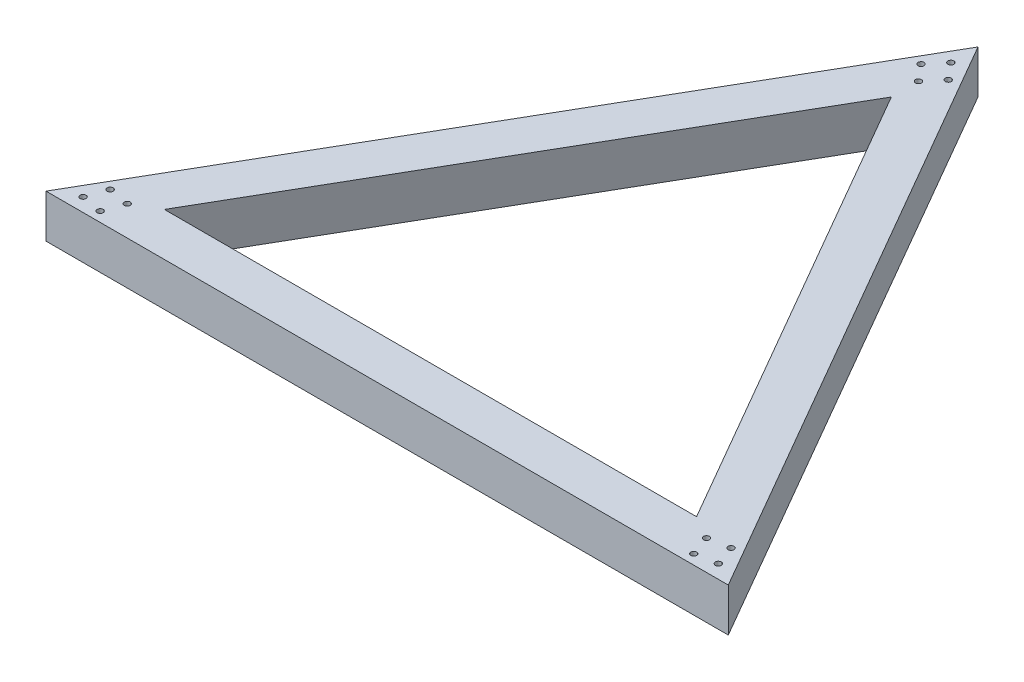
ISO-10303-21;
HEADER;
FILE_DESCRIPTION(('STEP AP214'),'2;1');
FILE_NAME('part.step','',(''),(''),'','','');
FILE_SCHEMA(('AUTOMOTIVE_DESIGN { 1 0 10303 214 1 1 1 1 }'));
ENDSEC;
DATA;
#1=APPLICATION_CONTEXT('core data for automotive mechanical design processes');
#2=APPLICATION_PROTOCOL_DEFINITION('international standard','automotive_design',2000,#1);
#3=PRODUCT_CONTEXT('',#1,'mechanical');
#4=PRODUCT('Part','Part','',(#3));
#5=PRODUCT_RELATED_PRODUCT_CATEGORY('part','',(#4));
#6=PRODUCT_DEFINITION_FORMATION('','',#4);
#7=PRODUCT_DEFINITION_CONTEXT('part definition',#1,'design');
#8=PRODUCT_DEFINITION('design','',#6,#7);
#9=PRODUCT_DEFINITION_SHAPE('','',#8);
#10=(LENGTH_UNIT() NAMED_UNIT(*) SI_UNIT(.MILLI.,.METRE.));
#11=(NAMED_UNIT(*) PLANE_ANGLE_UNIT() SI_UNIT($,.RADIAN.));
#12=(NAMED_UNIT(*) SI_UNIT($,.STERADIAN.) SOLID_ANGLE_UNIT());
#13=UNCERTAINTY_MEASURE_WITH_UNIT(LENGTH_MEASURE(1.E-05),#10,'distance_accuracy_value','');
#14=(GEOMETRIC_REPRESENTATION_CONTEXT(3) GLOBAL_UNCERTAINTY_ASSIGNED_CONTEXT((#13)) GLOBAL_UNIT_ASSIGNED_CONTEXT((#10,
#11,#12)) REPRESENTATION_CONTEXT('',''));
#15=CARTESIAN_POINT('',(0.,0.,0.));
#16=DIRECTION('',(0.,0.,1.));
#17=DIRECTION('',(1.,0.,0.));
#18=AXIS2_PLACEMENT_3D('',#15,#16,#17);
#19=CARTESIAN_POINT('',(0.,50.8,0.));
#20=DIRECTION('',(0.,1.,0.));
#21=DIRECTION('',(0.,0.,1.));
#22=AXIS2_PLACEMENT_3D('',#19,#20,#21);
#23=PLANE('',#22);
#24=CARTESIAN_POINT('',(-169.775713407923,50.8,98.0200538379252));
#25=DIRECTION('',(0.,1.,0.));
#26=DIRECTION('',(0.,0.,1.));
#27=AXIS2_PLACEMENT_3D('',#24,#25,#26);
#28=CIRCLE('',#27,1.75);
#29=CARTESIAN_POINT('',(-169.775713407923,50.8,99.7700538379252));
#30=VERTEX_POINT('',#29);
#31=EDGE_CURVE('E226',#30,#30,#28,.T.);
#32=ORIENTED_EDGE('',*,*,#31,.F.);
#33=EDGE_LOOP('',(#32));
#34=FACE_BOUND('',#33,.T.);
#35=CARTESIAN_POINT('',(-174.002954743875,50.8,109.698257068201));
#36=DIRECTION('',(0.,1.,0.));
#37=DIRECTION('',(0.,0.,1.));
#38=AXIS2_PLACEMENT_3D('',#35,#36,#37);
#39=CIRCLE('',#38,1.75000000000001);
#40=CARTESIAN_POINT('',(-174.002954743875,50.8,111.448257068201));
#41=VERTEX_POINT('',#40);
#42=EDGE_CURVE('E230',#41,#41,#39,.T.);
#43=ORIENTED_EDGE('',*,*,#42,.F.);
#44=EDGE_LOOP('',(#43));
#45=FACE_BOUND('',#44,.T.);
#46=CARTESIAN_POINT('',(-186.230196079827,50.8,107.520053837925));
#47=DIRECTION('',(0.,1.,0.));
#48=DIRECTION('',(0.,0.,1.));
#49=AXIS2_PLACEMENT_3D('',#46,#47,#48);
#50=CIRCLE('',#49,1.75000000000001);
#51=CARTESIAN_POINT('',(-186.230196079827,50.8,109.270053837925));
#52=VERTEX_POINT('',#51);
#53=EDGE_CURVE('E238',#52,#52,#50,.T.);
#54=ORIENTED_EDGE('',*,*,#53,.F.);
#55=EDGE_LOOP('',(#54));
#56=FACE_BOUND('',#55,.T.);
#57=CARTESIAN_POINT('',(174.002954743875,50.8,109.698257068201));
#58=DIRECTION('',(0.,1.,0.));
#59=DIRECTION('',(0.,0.,1.));
#60=AXIS2_PLACEMENT_3D('',#57,#58,#59);
#61=CIRCLE('',#60,1.75000000000001);
#62=CARTESIAN_POINT('',(174.002954743875,50.8,111.448257068201));
#63=VERTEX_POINT('',#62);
#64=EDGE_CURVE('E244',#63,#63,#61,.T.);
#65=ORIENTED_EDGE('',*,*,#64,.F.);
#66=EDGE_LOOP('',(#65));
#67=FACE_BOUND('',#66,.T.);
#68=CARTESIAN_POINT('',(186.230196079827,50.8,107.520053837925));
#69=DIRECTION('',(0.,1.,0.));
#70=DIRECTION('',(0.,0.,1.));
#71=AXIS2_PLACEMENT_3D('',#68,#69,#70);
#72=CIRCLE('',#71,1.75000000000001);
#73=CARTESIAN_POINT('',(186.230196079827,50.8,109.270053837925));
#74=VERTEX_POINT('',#73);
#75=EDGE_CURVE('E250',#74,#74,#72,.T.);
#76=ORIENTED_EDGE('',*,*,#75,.F.);
#77=EDGE_LOOP('',(#76));
#78=FACE_BOUND('',#77,.T.);
#79=CARTESIAN_POINT('',(182.002954743875,50.8,95.8418506076497));
#80=DIRECTION('',(0.,1.,0.));
#81=DIRECTION('',(0.,0.,1.));
#82=AXIS2_PLACEMENT_3D('',#79,#80,#81);
#83=CIRCLE('',#82,1.74999999999999);
#84=CARTESIAN_POINT('',(182.002954743875,50.8,97.5918506076497));
#85=VERTEX_POINT('',#84);
#86=EDGE_CURVE('E256',#85,#85,#83,.T.);
#87=ORIENTED_EDGE('',*,*,#86,.F.);
#88=EDGE_LOOP('',(#87));
#89=FACE_BOUND('',#88,.T.);
#90=CARTESIAN_POINT('',(169.775713407923,50.8,98.0200538379252));
#91=DIRECTION('',(0.,1.,0.));
#92=DIRECTION('',(0.,0.,1.));
#93=AXIS2_PLACEMENT_3D('',#90,#91,#92);
#94=CIRCLE('',#93,1.75000000000001);
#95=CARTESIAN_POINT('',(169.775713407923,50.8,99.7700538379252));
#96=VERTEX_POINT('',#95);
#97=EDGE_CURVE('E262',#96,#96,#94,.T.);
#98=ORIENTED_EDGE('',*,*,#97,.F.);
#99=EDGE_LOOP('',(#98));
#100=FACE_BOUND('',#99,.T.);
#101=CARTESIAN_POINT('',(0.,50.8,-196.04010767585));
#102=DIRECTION('',(0.,1.,0.));
#103=DIRECTION('',(0.,0.,1.));
#104=AXIS2_PLACEMENT_3D('',#101,#102,#103);
#105=CIRCLE('',#104,1.75);
#106=CARTESIAN_POINT('',(0.,50.8,-194.29010767585));
#107=VERTEX_POINT('',#106);
#108=EDGE_CURVE('E268',#107,#107,#105,.T.);
#109=ORIENTED_EDGE('',*,*,#108,.F.);
#110=EDGE_LOOP('',(#109));
#111=FACE_BOUND('',#110,.T.);
#112=CARTESIAN_POINT('',(8.,50.8,-205.54010767585));
#113=DIRECTION('',(0.,1.,0.));
#114=DIRECTION('',(0.,0.,1.));
#115=AXIS2_PLACEMENT_3D('',#112,#113,#114);
#116=CIRCLE('',#115,1.75000000000001);
#117=CARTESIAN_POINT('',(8.,50.8,-203.79010767585));
#118=VERTEX_POINT('',#117);
#119=EDGE_CURVE('E274',#118,#118,#116,.T.);
#120=ORIENTED_EDGE('',*,*,#119,.F.);
#121=EDGE_LOOP('',(#120));
#122=FACE_BOUND('',#121,.T.);
#123=CARTESIAN_POINT('',(0.,50.8,-215.04010767585));
#124=DIRECTION('',(0.,1.,0.));
#125=DIRECTION('',(0.,0.,1.));
#126=AXIS2_PLACEMENT_3D('',#123,#124,#125);
#127=CIRCLE('',#126,1.75);
#128=CARTESIAN_POINT('',(0.,50.8,-213.29010767585));
#129=VERTEX_POINT('',#128);
#130=EDGE_CURVE('E280',#129,#129,#127,.T.);
#131=ORIENTED_EDGE('',*,*,#130,.F.);
#132=EDGE_LOOP('',(#131));
#133=FACE_BOUND('',#132,.T.);
#134=CARTESIAN_POINT('',(-8.,50.8,-205.54010767585));
#135=DIRECTION('',(0.,1.,0.));
#136=DIRECTION('',(0.,0.,1.));
#137=AXIS2_PLACEMENT_3D('',#134,#135,#136);
#138=CIRCLE('',#137,1.75);
#139=CARTESIAN_POINT('',(-8.,50.8,-203.79010767585));
#140=VERTEX_POINT('',#139);
#141=EDGE_CURVE('E286',#140,#140,#138,.T.);
#142=ORIENTED_EDGE('',*,*,#141,.F.);
#143=EDGE_LOOP('',(#142));
#144=FACE_BOUND('',#143,.T.);
#145=CARTESIAN_POINT('',(-182.002954743875,50.8,95.8418506076497));
#146=DIRECTION('',(0.,1.,0.));
#147=DIRECTION('',(0.,0.,1.));
#148=AXIS2_PLACEMENT_3D('',#145,#146,#147);
#149=CIRCLE('',#148,1.75000000000001);
#150=CARTESIAN_POINT('',(-182.002954743875,50.8,97.5918506076497));
#151=VERTEX_POINT('',#150);
#152=EDGE_CURVE('E292',#151,#151,#149,.T.);
#153=ORIENTED_EDGE('',*,*,#152,.F.);
#154=EDGE_LOOP('',(#153));
#155=FACE_BOUND('',#154,.T.);
#156=DIRECTION('',(1.,0.,0.));
#157=VECTOR('',#156,1.);
#158=CARTESIAN_POINT('',(-200.,50.8,115.470053837925));
#159=LINE('',#158,#157);
#160=CARTESIAN_POINT('',(-200.,50.8,115.470053837925));
#161=VERTEX_POINT('',#160);
#162=CARTESIAN_POINT('',(200.,50.8,115.470053837925));
#163=VERTEX_POINT('',#162);
#164=EDGE_CURVE('E119',#161,#163,#159,.T.);
#165=ORIENTED_EDGE('',*,*,#164,.T.);
#166=DIRECTION('',(-0.5,0.,-0.866025403784439));
#167=VECTOR('',#166,1.);
#168=CARTESIAN_POINT('',(200.,50.8,115.470053837925));
#169=LINE('',#168,#167);
#170=CARTESIAN_POINT('',(0.,50.8,-230.94010767585));
#171=VERTEX_POINT('',#170);
#172=EDGE_CURVE('E122',#163,#171,#169,.T.);
#173=ORIENTED_EDGE('',*,*,#172,.T.);
#174=DIRECTION('',(-0.5,0.,0.866025403784439));
#175=VECTOR('',#174,1.);
#176=CARTESIAN_POINT('',(0.,50.8,-230.94010767585));
#177=LINE('',#176,#175);
#178=EDGE_CURVE('E125',#171,#161,#177,.T.);
#179=ORIENTED_EDGE('',*,*,#178,.T.);
#180=EDGE_LOOP('',(#165,#173,#179));
#181=FACE_BOUND('',#180,.T.);
#182=DIRECTION('',(-0.5,0.,-0.866025403784439));
#183=VECTOR('',#182,1.);
#184=CARTESIAN_POINT('',(156.005909487751,50.8,90.0700538379252));
#185=LINE('',#184,#183);
#186=CARTESIAN_POINT('',(156.005909487751,50.8,90.0700538379252));
#187=VERTEX_POINT('',#186);
#188=CARTESIAN_POINT('',(0.,50.8,-180.14010767585));
#189=VERTEX_POINT('',#188);
#190=EDGE_CURVE('E98',#187,#189,#185,.T.);
#191=ORIENTED_EDGE('',*,*,#190,.F.);
#192=DIRECTION('',(1.,0.,0.));
#193=VECTOR('',#192,1.);
#194=CARTESIAN_POINT('',(-156.005909487751,50.8,90.0700538379252));
#195=LINE('',#194,#193);
#196=CARTESIAN_POINT('',(-156.005909487751,50.8,90.0700538379252));
#197=VERTEX_POINT('',#196);
#198=EDGE_CURVE('E90',#197,#187,#195,.T.);
#199=ORIENTED_EDGE('',*,*,#198,.F.);
#200=DIRECTION('',(-0.5,0.,0.866025403784438));
#201=VECTOR('',#200,1.);
#202=CARTESIAN_POINT('',(0.,50.8,-180.14010767585));
#203=LINE('',#202,#201);
#204=EDGE_CURVE('E107',#189,#197,#203,.T.);
#205=ORIENTED_EDGE('',*,*,#204,.F.);
#206=EDGE_LOOP('',(#191,#199,#205));
#207=FACE_BOUND('',#206,.T.);
#208=ADVANCED_FACE('F37',(#34,#45,#56,#67,#78,#89,#100,#111,#122,#133,#144,#155,#181,#207),#23,.T.);
#209=CARTESIAN_POINT('',(0.,25.4,0.));
#210=DIRECTION('',(0.,1.,0.));
#211=DIRECTION('',(0.,0.,1.));
#212=AXIS2_PLACEMENT_3D('',#209,#210,#211);
#213=PLANE('',#212);
#214=CARTESIAN_POINT('',(-169.775713407923,25.4,98.0200538379252));
#215=DIRECTION('',(0.,1.,0.));
#216=DIRECTION('',(0.,0.,1.));
#217=AXIS2_PLACEMENT_3D('',#214,#215,#216);
#218=CIRCLE('',#217,1.75);
#219=CARTESIAN_POINT('',(-169.775713407923,25.4,99.7700538379252));
#220=VERTEX_POINT('',#219);
#221=EDGE_CURVE('E113',#220,#220,#218,.T.);
#222=ORIENTED_EDGE('',*,*,#221,.T.);
#223=EDGE_LOOP('',(#222));
#224=FACE_BOUND('',#223,.T.);
#225=CARTESIAN_POINT('',(-174.002954743875,25.4,109.698257068201));
#226=DIRECTION('',(0.,1.,0.));
#227=DIRECTION('',(0.,0.,1.));
#228=AXIS2_PLACEMENT_3D('',#225,#226,#227);
#229=CIRCLE('',#228,1.75000000000001);
#230=CARTESIAN_POINT('',(-174.002954743875,25.4,111.448257068201));
#231=VERTEX_POINT('',#230);
#232=EDGE_CURVE('E235',#231,#231,#229,.T.);
#233=ORIENTED_EDGE('',*,*,#232,.T.);
#234=EDGE_LOOP('',(#233));
#235=FACE_BOUND('',#234,.T.);
#236=CARTESIAN_POINT('',(-186.230196079827,25.4,107.520053837925));
#237=DIRECTION('',(0.,1.,0.));
#238=DIRECTION('',(0.,0.,1.));
#239=AXIS2_PLACEMENT_3D('',#236,#237,#238);
#240=CIRCLE('',#239,1.75000000000001);
#241=CARTESIAN_POINT('',(-186.230196079827,25.4,109.270053837925));
#242=VERTEX_POINT('',#241);
#243=EDGE_CURVE('E241',#242,#242,#240,.T.);
#244=ORIENTED_EDGE('',*,*,#243,.T.);
#245=EDGE_LOOP('',(#244));
#246=FACE_BOUND('',#245,.T.);
#247=CARTESIAN_POINT('',(174.002954743875,25.4,109.698257068201));
#248=DIRECTION('',(0.,1.,0.));
#249=DIRECTION('',(0.,0.,1.));
#250=AXIS2_PLACEMENT_3D('',#247,#248,#249);
#251=CIRCLE('',#250,1.75000000000001);
#252=CARTESIAN_POINT('',(174.002954743875,25.4,111.448257068201));
#253=VERTEX_POINT('',#252);
#254=EDGE_CURVE('E247',#253,#253,#251,.T.);
#255=ORIENTED_EDGE('',*,*,#254,.T.);
#256=EDGE_LOOP('',(#255));
#257=FACE_BOUND('',#256,.T.);
#258=CARTESIAN_POINT('',(186.230196079827,25.4,107.520053837925));
#259=DIRECTION('',(0.,1.,0.));
#260=DIRECTION('',(0.,0.,1.));
#261=AXIS2_PLACEMENT_3D('',#258,#259,#260);
#262=CIRCLE('',#261,1.75000000000001);
#263=CARTESIAN_POINT('',(186.230196079827,25.4,109.270053837925));
#264=VERTEX_POINT('',#263);
#265=EDGE_CURVE('E253',#264,#264,#262,.T.);
#266=ORIENTED_EDGE('',*,*,#265,.T.);
#267=EDGE_LOOP('',(#266));
#268=FACE_BOUND('',#267,.T.);
#269=CARTESIAN_POINT('',(182.002954743875,25.4,95.8418506076497));
#270=DIRECTION('',(0.,1.,0.));
#271=DIRECTION('',(0.,0.,1.));
#272=AXIS2_PLACEMENT_3D('',#269,#270,#271);
#273=CIRCLE('',#272,1.74999999999999);
#274=CARTESIAN_POINT('',(182.002954743875,25.4,97.5918506076497));
#275=VERTEX_POINT('',#274);
#276=EDGE_CURVE('E259',#275,#275,#273,.T.);
#277=ORIENTED_EDGE('',*,*,#276,.T.);
#278=EDGE_LOOP('',(#277));
#279=FACE_BOUND('',#278,.T.);
#280=CARTESIAN_POINT('',(169.775713407923,25.4,98.0200538379252));
#281=DIRECTION('',(0.,1.,0.));
#282=DIRECTION('',(0.,0.,1.));
#283=AXIS2_PLACEMENT_3D('',#280,#281,#282);
#284=CIRCLE('',#283,1.75000000000001);
#285=CARTESIAN_POINT('',(169.775713407923,25.4,99.7700538379252));
#286=VERTEX_POINT('',#285);
#287=EDGE_CURVE('E265',#286,#286,#284,.T.);
#288=ORIENTED_EDGE('',*,*,#287,.T.);
#289=EDGE_LOOP('',(#288));
#290=FACE_BOUND('',#289,.T.);
#291=CARTESIAN_POINT('',(0.,25.4,-196.04010767585));
#292=DIRECTION('',(0.,1.,0.));
#293=DIRECTION('',(0.,0.,1.));
#294=AXIS2_PLACEMENT_3D('',#291,#292,#293);
#295=CIRCLE('',#294,1.75);
#296=CARTESIAN_POINT('',(0.,25.4,-194.29010767585));
#297=VERTEX_POINT('',#296);
#298=EDGE_CURVE('E271',#297,#297,#295,.T.);
#299=ORIENTED_EDGE('',*,*,#298,.T.);
#300=EDGE_LOOP('',(#299));
#301=FACE_BOUND('',#300,.T.);
#302=CARTESIAN_POINT('',(8.,25.4,-205.54010767585));
#303=DIRECTION('',(0.,1.,0.));
#304=DIRECTION('',(0.,0.,1.));
#305=AXIS2_PLACEMENT_3D('',#302,#303,#304);
#306=CIRCLE('',#305,1.75000000000001);
#307=CARTESIAN_POINT('',(8.,25.4,-203.79010767585));
#308=VERTEX_POINT('',#307);
#309=EDGE_CURVE('E277',#308,#308,#306,.T.);
#310=ORIENTED_EDGE('',*,*,#309,.T.);
#311=EDGE_LOOP('',(#310));
#312=FACE_BOUND('',#311,.T.);
#313=CARTESIAN_POINT('',(0.,25.4,-215.04010767585));
#314=DIRECTION('',(0.,1.,0.));
#315=DIRECTION('',(0.,0.,1.));
#316=AXIS2_PLACEMENT_3D('',#313,#314,#315);
#317=CIRCLE('',#316,1.75);
#318=CARTESIAN_POINT('',(0.,25.4,-213.29010767585));
#319=VERTEX_POINT('',#318);
#320=EDGE_CURVE('E283',#319,#319,#317,.T.);
#321=ORIENTED_EDGE('',*,*,#320,.T.);
#322=EDGE_LOOP('',(#321));
#323=FACE_BOUND('',#322,.T.);
#324=CARTESIAN_POINT('',(-8.,25.4,-205.54010767585));
#325=DIRECTION('',(0.,1.,0.));
#326=DIRECTION('',(0.,0.,1.));
#327=AXIS2_PLACEMENT_3D('',#324,#325,#326);
#328=CIRCLE('',#327,1.75);
#329=CARTESIAN_POINT('',(-8.,25.4,-203.79010767585));
#330=VERTEX_POINT('',#329);
#331=EDGE_CURVE('E289',#330,#330,#328,.T.);
#332=ORIENTED_EDGE('',*,*,#331,.T.);
#333=EDGE_LOOP('',(#332));
#334=FACE_BOUND('',#333,.T.);
#335=CARTESIAN_POINT('',(-182.002954743875,25.4,95.8418506076497));
#336=DIRECTION('',(0.,1.,0.));
#337=DIRECTION('',(0.,0.,1.));
#338=AXIS2_PLACEMENT_3D('',#335,#336,#337);
#339=CIRCLE('',#338,1.75000000000001);
#340=CARTESIAN_POINT('',(-182.002954743875,25.4,97.5918506076497));
#341=VERTEX_POINT('',#340);
#342=EDGE_CURVE('E294',#341,#341,#339,.T.);
#343=ORIENTED_EDGE('',*,*,#342,.T.);
#344=EDGE_LOOP('',(#343));
#345=FACE_BOUND('',#344,.T.);
#346=DIRECTION('',(1.,0.,0.));
#347=VECTOR('',#346,1.);
#348=CARTESIAN_POINT('',(-200.,25.4,115.470053837925));
#349=LINE('',#348,#347);
#350=CARTESIAN_POINT('',(-200.,25.4,115.470053837925));
#351=VERTEX_POINT('',#350);
#352=CARTESIAN_POINT('',(200.,25.4,115.470053837925));
#353=VERTEX_POINT('',#352);
#354=EDGE_CURVE('E105',#351,#353,#349,.T.);
#355=ORIENTED_EDGE('',*,*,#354,.F.);
#356=DIRECTION('',(-0.5,0.,0.866025403784439));
#357=VECTOR('',#356,1.);
#358=CARTESIAN_POINT('',(0.,25.4,-230.94010767585));
#359=LINE('',#358,#357);
#360=CARTESIAN_POINT('',(0.,25.4,-230.94010767585));
#361=VERTEX_POINT('',#360);
#362=EDGE_CURVE('E123',#361,#351,#359,.T.);
#363=ORIENTED_EDGE('',*,*,#362,.F.);
#364=DIRECTION('',(-0.5,0.,-0.866025403784439));
#365=VECTOR('',#364,1.);
#366=CARTESIAN_POINT('',(200.,25.4,115.470053837925));
#367=LINE('',#366,#365);
#368=EDGE_CURVE('E130',#353,#361,#367,.T.);
#369=ORIENTED_EDGE('',*,*,#368,.F.);
#370=EDGE_LOOP('',(#355,#363,#369));
#371=FACE_BOUND('',#370,.T.);
#372=DIRECTION('',(1.,0.,0.));
#373=VECTOR('',#372,1.);
#374=CARTESIAN_POINT('',(-156.005909487751,25.4,90.0700538379252));
#375=LINE('',#374,#373);
#376=CARTESIAN_POINT('',(-156.005909487751,25.4,90.0700538379252));
#377=VERTEX_POINT('',#376);
#378=CARTESIAN_POINT('',(156.005909487751,25.4,90.0700538379252));
#379=VERTEX_POINT('',#378);
#380=EDGE_CURVE('E60',#377,#379,#375,.T.);
#381=ORIENTED_EDGE('',*,*,#380,.T.);
#382=DIRECTION('',(-0.5,0.,-0.866025403784439));
#383=VECTOR('',#382,1.);
#384=CARTESIAN_POINT('',(156.005909487751,25.4,90.0700538379252));
#385=LINE('',#384,#383);
#386=CARTESIAN_POINT('',(0.,25.4,-180.14010767585));
#387=VERTEX_POINT('',#386);
#388=EDGE_CURVE('E104',#379,#387,#385,.T.);
#389=ORIENTED_EDGE('',*,*,#388,.T.);
#390=DIRECTION('',(-0.5,0.,0.866025403784438));
#391=VECTOR('',#390,1.);
#392=CARTESIAN_POINT('',(0.,25.4,-180.14010767585));
#393=LINE('',#392,#391);
#394=EDGE_CURVE('E99',#387,#377,#393,.T.);
#395=ORIENTED_EDGE('',*,*,#394,.T.);
#396=EDGE_LOOP('',(#381,#389,#395));
#397=FACE_BOUND('',#396,.T.);
#398=ADVANCED_FACE('F144',(#224,#235,#246,#257,#268,#279,#290,#301,#312,#323,#334,#345,#371,
#397),#213,.F.);
#399=CARTESIAN_POINT('',(-200.,50.8,115.470053837925));
#400=DIRECTION('',(0.,0.,-1.));
#401=DIRECTION('',(-1.,0.,0.));
#402=AXIS2_PLACEMENT_3D('',#399,#400,#401);
#403=PLANE('',#402);
#404=ORIENTED_EDGE('',*,*,#354,.T.);
#405=DIRECTION('',(0.,-1.,0.));
#406=VECTOR('',#405,1.);
#407=CARTESIAN_POINT('',(200.,50.8,115.470053837925));
#408=LINE('',#407,#406);
#409=EDGE_CURVE('E11',#163,#353,#408,.T.);
#410=ORIENTED_EDGE('',*,*,#409,.F.);
#411=ORIENTED_EDGE('',*,*,#164,.F.);
#412=DIRECTION('',(0.,-1.,0.));
#413=VECTOR('',#412,1.);
#414=CARTESIAN_POINT('',(-200.,50.8,115.470053837925));
#415=LINE('',#414,#413);
#416=EDGE_CURVE('E127',#161,#351,#415,.T.);
#417=ORIENTED_EDGE('',*,*,#416,.T.);
#418=EDGE_LOOP('',(#404,#410,#411,#417));
#419=FACE_BOUND('',#418,.T.);
#420=ADVANCED_FACE('F39',(#419),#403,.F.);
#421=CARTESIAN_POINT('',(200.,50.8,115.470053837925));
#422=DIRECTION('',(-0.866025403784439,0.,0.5));
#423=DIRECTION('',(0.5,0.,0.866025403784439));
#424=AXIS2_PLACEMENT_3D('',#421,#422,#423);
#425=PLANE('',#424);
#426=ORIENTED_EDGE('',*,*,#368,.T.);
#427=DIRECTION('',(0.,-1.,0.));
#428=VECTOR('',#427,1.);
#429=CARTESIAN_POINT('',(0.,50.8,-230.94010767585));
#430=LINE('',#429,#428);
#431=EDGE_CURVE('E45',#171,#361,#430,.T.);
#432=ORIENTED_EDGE('',*,*,#431,.F.);
#433=ORIENTED_EDGE('',*,*,#172,.F.);
#434=ORIENTED_EDGE('',*,*,#409,.T.);
#435=EDGE_LOOP('',(#426,#432,#433,#434));
#436=FACE_BOUND('',#435,.T.);
#437=ADVANCED_FACE('F150',(#436),#425,.F.);
#438=CARTESIAN_POINT('',(0.,50.8,-230.94010767585));
#439=DIRECTION('',(0.866025403784439,0.,0.5));
#440=DIRECTION('',(0.5,0.,-0.866025403784439));
#441=AXIS2_PLACEMENT_3D('',#438,#439,#440);
#442=PLANE('',#441);
#443=ORIENTED_EDGE('',*,*,#362,.T.);
#444=ORIENTED_EDGE('',*,*,#416,.F.);
#445=ORIENTED_EDGE('',*,*,#178,.F.);
#446=ORIENTED_EDGE('',*,*,#431,.T.);
#447=EDGE_LOOP('',(#443,#444,#445,#446));
#448=FACE_BOUND('',#447,.T.);
#449=ADVANCED_FACE('F139',(#448),#442,.F.);
#450=CARTESIAN_POINT('',(-156.005909487751,50.8,90.0700538379252));
#451=DIRECTION('',(0.,0.,-1.));
#452=DIRECTION('',(-1.,0.,0.));
#453=AXIS2_PLACEMENT_3D('',#450,#451,#452);
#454=PLANE('',#453);
#455=ORIENTED_EDGE('',*,*,#380,.F.);
#456=DIRECTION('',(0.,-1.,0.));
#457=VECTOR('',#456,1.);
#458=CARTESIAN_POINT('',(-156.005909487751,50.8,90.0700538379252));
#459=LINE('',#458,#457);
#460=EDGE_CURVE('E94',#197,#377,#459,.T.);
#461=ORIENTED_EDGE('',*,*,#460,.F.);
#462=ORIENTED_EDGE('',*,*,#198,.T.);
#463=DIRECTION('',(0.,-1.,0.));
#464=VECTOR('',#463,1.);
#465=CARTESIAN_POINT('',(156.005909487751,50.8,90.0700538379252));
#466=LINE('',#465,#464);
#467=EDGE_CURVE('E93',#187,#379,#466,.T.);
#468=ORIENTED_EDGE('',*,*,#467,.T.);
#469=EDGE_LOOP('',(#455,#461,#462,#468));
#470=FACE_BOUND('',#469,.T.);
#471=ADVANCED_FACE('F92',(#470),#454,.T.);
#472=CARTESIAN_POINT('',(156.005909487751,50.8,90.0700538379252));
#473=DIRECTION('',(-0.866025403784439,0.,0.5));
#474=DIRECTION('',(0.5,0.,0.866025403784439));
#475=AXIS2_PLACEMENT_3D('',#472,#473,#474);
#476=PLANE('',#475);
#477=ORIENTED_EDGE('',*,*,#388,.F.);
#478=ORIENTED_EDGE('',*,*,#467,.F.);
#479=ORIENTED_EDGE('',*,*,#190,.T.);
#480=DIRECTION('',(0.,-1.,0.));
#481=VECTOR('',#480,1.);
#482=CARTESIAN_POINT('',(0.,50.8,-180.14010767585));
#483=LINE('',#482,#481);
#484=EDGE_CURVE('E52',#189,#387,#483,.T.);
#485=ORIENTED_EDGE('',*,*,#484,.T.);
#486=EDGE_LOOP('',(#477,#478,#479,#485));
#487=FACE_BOUND('',#486,.T.);
#488=ADVANCED_FACE('F102',(#487),#476,.T.);
#489=CARTESIAN_POINT('',(0.,50.8,-180.14010767585));
#490=DIRECTION('',(0.866025403784438,0.,0.5));
#491=DIRECTION('',(0.5,0.,-0.866025403784439));
#492=AXIS2_PLACEMENT_3D('',#489,#490,#491);
#493=PLANE('',#492);
#494=ORIENTED_EDGE('',*,*,#394,.F.);
#495=ORIENTED_EDGE('',*,*,#484,.F.);
#496=ORIENTED_EDGE('',*,*,#204,.T.);
#497=ORIENTED_EDGE('',*,*,#460,.T.);
#498=EDGE_LOOP('',(#494,#495,#496,#497));
#499=FACE_BOUND('',#498,.T.);
#500=ADVANCED_FACE('F172',(#499),#493,.T.);
#501=CARTESIAN_POINT('',(-182.002954743875,25.4,95.8418506076497));
#502=DIRECTION('',(0.,1.,0.));
#503=DIRECTION('',(0.,0.,1.));
#504=AXIS2_PLACEMENT_3D('',#501,#502,#503);
#505=CYLINDRICAL_SURFACE('',#504,1.75000000000001);
#506=ORIENTED_EDGE('',*,*,#152,.T.);
#507=EDGE_LOOP('',(#506));
#508=FACE_BOUND('',#507,.T.);
#509=ORIENTED_EDGE('',*,*,#342,.F.);
#510=EDGE_LOOP('',(#509));
#511=FACE_BOUND('',#510,.T.);
#512=ADVANCED_FACE('F175',(#508,#511),#505,.F.);
#513=CARTESIAN_POINT('',(-8.,25.4,-205.54010767585));
#514=DIRECTION('',(0.,1.,0.));
#515=DIRECTION('',(0.,0.,1.));
#516=AXIS2_PLACEMENT_3D('',#513,#514,#515);
#517=CYLINDRICAL_SURFACE('',#516,1.75);
#518=ORIENTED_EDGE('',*,*,#331,.F.);
#519=EDGE_LOOP('',(#518));
#520=FACE_BOUND('',#519,.T.);
#521=ORIENTED_EDGE('',*,*,#141,.T.);
#522=EDGE_LOOP('',(#521));
#523=FACE_BOUND('',#522,.T.);
#524=ADVANCED_FACE('F178',(#520,#523),#517,.F.);
#525=CARTESIAN_POINT('',(0.,25.4,-215.04010767585));
#526=DIRECTION('',(0.,1.,0.));
#527=DIRECTION('',(0.,0.,1.));
#528=AXIS2_PLACEMENT_3D('',#525,#526,#527);
#529=CYLINDRICAL_SURFACE('',#528,1.75);
#530=ORIENTED_EDGE('',*,*,#320,.F.);
#531=EDGE_LOOP('',(#530));
#532=FACE_BOUND('',#531,.T.);
#533=ORIENTED_EDGE('',*,*,#130,.T.);
#534=EDGE_LOOP('',(#533));
#535=FACE_BOUND('',#534,.T.);
#536=ADVANCED_FACE('F182',(#532,#535),#529,.F.);
#537=CARTESIAN_POINT('',(8.,25.4,-205.54010767585));
#538=DIRECTION('',(0.,1.,0.));
#539=DIRECTION('',(0.,0.,1.));
#540=AXIS2_PLACEMENT_3D('',#537,#538,#539);
#541=CYLINDRICAL_SURFACE('',#540,1.75000000000001);
#542=ORIENTED_EDGE('',*,*,#309,.F.);
#543=EDGE_LOOP('',(#542));
#544=FACE_BOUND('',#543,.T.);
#545=ORIENTED_EDGE('',*,*,#119,.T.);
#546=EDGE_LOOP('',(#545));
#547=FACE_BOUND('',#546,.T.);
#548=ADVANCED_FACE('F186',(#544,#547),#541,.F.);
#549=CARTESIAN_POINT('',(0.,25.4,-196.04010767585));
#550=DIRECTION('',(0.,1.,0.));
#551=DIRECTION('',(0.,0.,1.));
#552=AXIS2_PLACEMENT_3D('',#549,#550,#551);
#553=CYLINDRICAL_SURFACE('',#552,1.75);
#554=ORIENTED_EDGE('',*,*,#298,.F.);
#555=EDGE_LOOP('',(#554));
#556=FACE_BOUND('',#555,.T.);
#557=ORIENTED_EDGE('',*,*,#108,.T.);
#558=EDGE_LOOP('',(#557));
#559=FACE_BOUND('',#558,.T.);
#560=ADVANCED_FACE('F190',(#556,#559),#553,.F.);
#561=CARTESIAN_POINT('',(169.775713407923,25.4,98.0200538379252));
#562=DIRECTION('',(0.,1.,0.));
#563=DIRECTION('',(0.,0.,1.));
#564=AXIS2_PLACEMENT_3D('',#561,#562,#563);
#565=CYLINDRICAL_SURFACE('',#564,1.75000000000001);
#566=ORIENTED_EDGE('',*,*,#287,.F.);
#567=EDGE_LOOP('',(#566));
#568=FACE_BOUND('',#567,.T.);
#569=ORIENTED_EDGE('',*,*,#97,.T.);
#570=EDGE_LOOP('',(#569));
#571=FACE_BOUND('',#570,.T.);
#572=ADVANCED_FACE('F194',(#568,#571),#565,.F.);
#573=CARTESIAN_POINT('',(182.002954743875,25.4,95.8418506076497));
#574=DIRECTION('',(0.,1.,0.));
#575=DIRECTION('',(0.,0.,1.));
#576=AXIS2_PLACEMENT_3D('',#573,#574,#575);
#577=CYLINDRICAL_SURFACE('',#576,1.74999999999999);
#578=ORIENTED_EDGE('',*,*,#276,.F.);
#579=EDGE_LOOP('',(#578));
#580=FACE_BOUND('',#579,.T.);
#581=ORIENTED_EDGE('',*,*,#86,.T.);
#582=EDGE_LOOP('',(#581));
#583=FACE_BOUND('',#582,.T.);
#584=ADVANCED_FACE('F198',(#580,#583),#577,.F.);
#585=CARTESIAN_POINT('',(186.230196079827,25.4,107.520053837925));
#586=DIRECTION('',(0.,1.,0.));
#587=DIRECTION('',(0.,0.,1.));
#588=AXIS2_PLACEMENT_3D('',#585,#586,#587);
#589=CYLINDRICAL_SURFACE('',#588,1.75000000000001);
#590=ORIENTED_EDGE('',*,*,#265,.F.);
#591=EDGE_LOOP('',(#590));
#592=FACE_BOUND('',#591,.T.);
#593=ORIENTED_EDGE('',*,*,#75,.T.);
#594=EDGE_LOOP('',(#593));
#595=FACE_BOUND('',#594,.T.);
#596=ADVANCED_FACE('F202',(#592,#595),#589,.F.);
#597=CARTESIAN_POINT('',(174.002954743875,25.4,109.698257068201));
#598=DIRECTION('',(0.,1.,0.));
#599=DIRECTION('',(0.,0.,1.));
#600=AXIS2_PLACEMENT_3D('',#597,#598,#599);
#601=CYLINDRICAL_SURFACE('',#600,1.75000000000001);
#602=ORIENTED_EDGE('',*,*,#254,.F.);
#603=EDGE_LOOP('',(#602));
#604=FACE_BOUND('',#603,.T.);
#605=ORIENTED_EDGE('',*,*,#64,.T.);
#606=EDGE_LOOP('',(#605));
#607=FACE_BOUND('',#606,.T.);
#608=ADVANCED_FACE('F206',(#604,#607),#601,.F.);
#609=CARTESIAN_POINT('',(-186.230196079827,25.4,107.520053837925));
#610=DIRECTION('',(0.,1.,0.));
#611=DIRECTION('',(0.,0.,1.));
#612=AXIS2_PLACEMENT_3D('',#609,#610,#611);
#613=CYLINDRICAL_SURFACE('',#612,1.75000000000001);
#614=ORIENTED_EDGE('',*,*,#243,.F.);
#615=EDGE_LOOP('',(#614));
#616=FACE_BOUND('',#615,.T.);
#617=ORIENTED_EDGE('',*,*,#53,.T.);
#618=EDGE_LOOP('',(#617));
#619=FACE_BOUND('',#618,.T.);
#620=ADVANCED_FACE('F210',(#616,#619),#613,.F.);
#621=CARTESIAN_POINT('',(-174.002954743875,25.4,109.698257068201));
#622=DIRECTION('',(0.,1.,0.));
#623=DIRECTION('',(0.,0.,1.));
#624=AXIS2_PLACEMENT_3D('',#621,#622,#623);
#625=CYLINDRICAL_SURFACE('',#624,1.75000000000001);
#626=ORIENTED_EDGE('',*,*,#232,.F.);
#627=EDGE_LOOP('',(#626));
#628=FACE_BOUND('',#627,.T.);
#629=ORIENTED_EDGE('',*,*,#42,.T.);
#630=EDGE_LOOP('',(#629));
#631=FACE_BOUND('',#630,.T.);
#632=ADVANCED_FACE('F214',(#628,#631),#625,.F.);
#633=CARTESIAN_POINT('',(-169.775713407923,25.4,98.0200538379252));
#634=DIRECTION('',(0.,1.,0.));
#635=DIRECTION('',(0.,0.,1.));
#636=AXIS2_PLACEMENT_3D('',#633,#634,#635);
#637=CYLINDRICAL_SURFACE('',#636,1.75);
#638=ORIENTED_EDGE('',*,*,#31,.T.);
#639=EDGE_LOOP('',(#638));
#640=FACE_BOUND('',#639,.T.);
#641=ORIENTED_EDGE('',*,*,#221,.F.);
#642=EDGE_LOOP('',(#641));
#643=FACE_BOUND('',#642,.T.);
#644=ADVANCED_FACE('F218',(#640,#643),#637,.F.);
#645=CLOSED_SHELL('',(#208,#398,#420,#437,#449,#471,#488,#500,#512,#524,#536,#548,#560,#572,
#584,#596,#608,#620,#632,#644));
#646=MANIFOLD_SOLID_BREP('B2',#645);
#647=ADVANCED_BREP_SHAPE_REPRESENTATION('',(#18,#646),#14);
#648=SHAPE_DEFINITION_REPRESENTATION(#9,#647);
ENDSEC;
END-ISO-10303-21;
